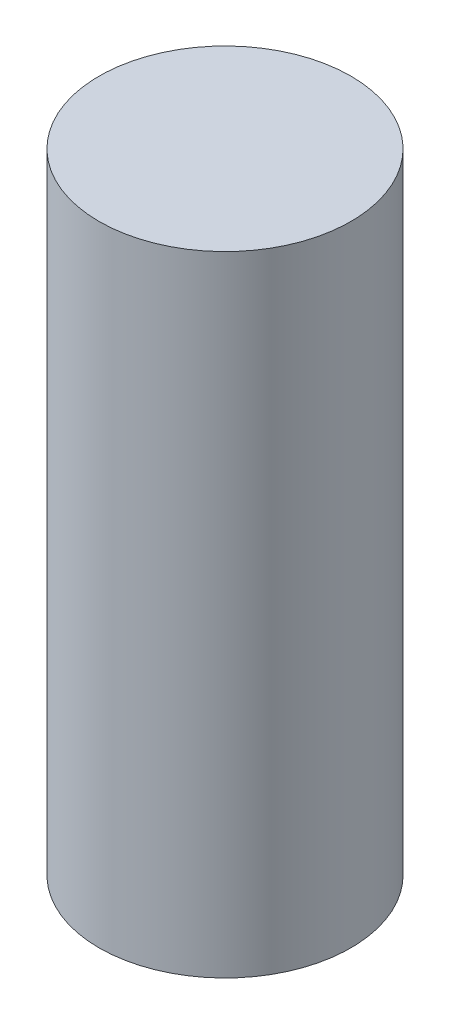
ISO-10303-21;
HEADER;
FILE_DESCRIPTION(('STEP AP214'),'2;1');
FILE_NAME('part.step','',(''),(''),'','','');
FILE_SCHEMA(('AUTOMOTIVE_DESIGN { 1 0 10303 214 1 1 1 1 }'));
ENDSEC;
DATA;
#1=APPLICATION_CONTEXT('core data for automotive mechanical design processes');
#2=APPLICATION_PROTOCOL_DEFINITION('international standard','automotive_design',2000,#1);
#3=PRODUCT_CONTEXT('',#1,'mechanical');
#4=PRODUCT('Part','Part','',(#3));
#5=PRODUCT_RELATED_PRODUCT_CATEGORY('part','',(#4));
#6=PRODUCT_DEFINITION_FORMATION('','',#4);
#7=PRODUCT_DEFINITION_CONTEXT('part definition',#1,'design');
#8=PRODUCT_DEFINITION('design','',#6,#7);
#9=PRODUCT_DEFINITION_SHAPE('','',#8);
#10=(LENGTH_UNIT() NAMED_UNIT(*) SI_UNIT(.MILLI.,.METRE.));
#11=(NAMED_UNIT(*) PLANE_ANGLE_UNIT() SI_UNIT($,.RADIAN.));
#12=(NAMED_UNIT(*) SI_UNIT($,.STERADIAN.) SOLID_ANGLE_UNIT());
#13=UNCERTAINTY_MEASURE_WITH_UNIT(LENGTH_MEASURE(1.E-05),#10,'distance_accuracy_value','');
#14=(GEOMETRIC_REPRESENTATION_CONTEXT(3) GLOBAL_UNCERTAINTY_ASSIGNED_CONTEXT((#13)) GLOBAL_UNIT_ASSIGNED_CONTEXT((#10,
#11,#12)) REPRESENTATION_CONTEXT('',''));
#15=CARTESIAN_POINT('',(0.,0.,0.));
#16=DIRECTION('',(0.,0.,1.));
#17=DIRECTION('',(1.,0.,0.));
#18=AXIS2_PLACEMENT_3D('',#15,#16,#17);
#19=CARTESIAN_POINT('',(0.,254.,0.));
#20=DIRECTION('',(0.,-1.,0.));
#21=DIRECTION('',(0.,0.,-1.));
#22=AXIS2_PLACEMENT_3D('',#19,#20,#21);
#23=CYLINDRICAL_SURFACE('',#22,50.8381);
#24=CARTESIAN_POINT('',(0.,254.,0.));
#25=DIRECTION('',(0.,1.,0.));
#26=DIRECTION('',(0.,0.,1.));
#27=AXIS2_PLACEMENT_3D('',#24,#25,#26);
#28=CIRCLE('',#27,50.8381);
#29=CARTESIAN_POINT('',(0.,254.,50.8381));
#30=VERTEX_POINT('',#29);
#31=EDGE_CURVE('E10',#30,#30,#28,.T.);
#32=ORIENTED_EDGE('',*,*,#31,.F.);
#33=EDGE_LOOP('',(#32));
#34=FACE_BOUND('',#33,.T.);
#35=CARTESIAN_POINT('',(0.,0.,0.));
#36=DIRECTION('',(0.,1.,0.));
#37=DIRECTION('',(0.,0.,1.));
#38=AXIS2_PLACEMENT_3D('',#35,#36,#37);
#39=CIRCLE('',#38,50.8381);
#40=CARTESIAN_POINT('',(0.,0.,50.8381));
#41=VERTEX_POINT('',#40);
#42=EDGE_CURVE('E38',#41,#41,#39,.T.);
#43=ORIENTED_EDGE('',*,*,#42,.T.);
#44=EDGE_LOOP('',(#43));
#45=FACE_BOUND('',#44,.T.);
#46=ADVANCED_FACE('F35',(#34,#45),#23,.T.);
#47=CARTESIAN_POINT('',(0.,254.,0.));
#48=DIRECTION('',(0.,1.,0.));
#49=DIRECTION('',(0.,0.,1.));
#50=AXIS2_PLACEMENT_3D('',#47,#48,#49);
#51=PLANE('',#50);
#52=ORIENTED_EDGE('',*,*,#31,.T.);
#53=EDGE_LOOP('',(#52));
#54=FACE_BOUND('',#53,.T.);
#55=ADVANCED_FACE('F50',(#54),#51,.T.);
#56=CARTESIAN_POINT('',(0.,0.,0.));
#57=DIRECTION('',(0.,1.,0.));
#58=DIRECTION('',(0.,0.,1.));
#59=AXIS2_PLACEMENT_3D('',#56,#57,#58);
#60=PLANE('',#59);
#61=ORIENTED_EDGE('',*,*,#42,.F.);
#62=EDGE_LOOP('',(#61));
#63=FACE_BOUND('',#62,.T.);
#64=ADVANCED_FACE('F48',(#63),#60,.F.);
#65=CLOSED_SHELL('',(#46,#55,#64));
#66=MANIFOLD_SOLID_BREP('B2',#65);
#67=ADVANCED_BREP_SHAPE_REPRESENTATION('',(#18,#66),#14);
#68=SHAPE_DEFINITION_REPRESENTATION(#9,#67);
ENDSEC;
END-ISO-10303-21;
